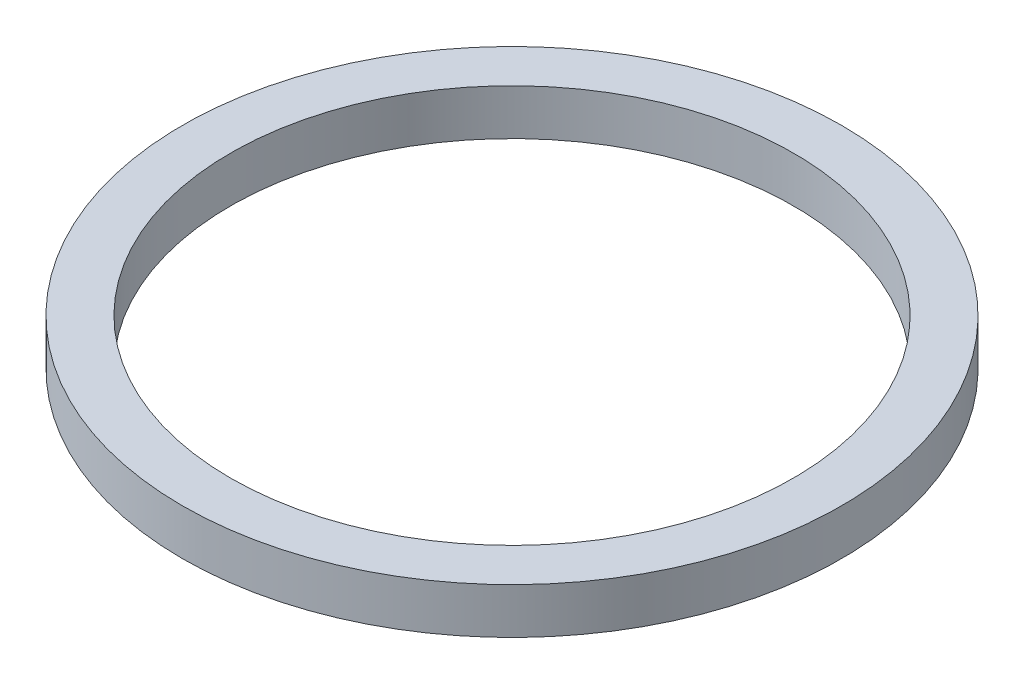
ISO-10303-21;
HEADER;
FILE_DESCRIPTION(('STEP AP214'),'2;1');
FILE_NAME('part.step','',(''),(''),'','','');
FILE_SCHEMA(('AUTOMOTIVE_DESIGN { 1 0 10303 214 1 1 1 1 }'));
ENDSEC;
DATA;
#1=APPLICATION_CONTEXT('core data for automotive mechanical design processes');
#2=APPLICATION_PROTOCOL_DEFINITION('international standard','automotive_design',2000,#1);
#3=PRODUCT_CONTEXT('',#1,'mechanical');
#4=PRODUCT('Part','Part','',(#3));
#5=PRODUCT_RELATED_PRODUCT_CATEGORY('part','',(#4));
#6=PRODUCT_DEFINITION_FORMATION('','',#4);
#7=PRODUCT_DEFINITION_CONTEXT('part definition',#1,'design');
#8=PRODUCT_DEFINITION('design','',#6,#7);
#9=PRODUCT_DEFINITION_SHAPE('','',#8);
#10=(LENGTH_UNIT() NAMED_UNIT(*) SI_UNIT(.MILLI.,.METRE.));
#11=(NAMED_UNIT(*) PLANE_ANGLE_UNIT() SI_UNIT($,.RADIAN.));
#12=(NAMED_UNIT(*) SI_UNIT($,.STERADIAN.) SOLID_ANGLE_UNIT());
#13=UNCERTAINTY_MEASURE_WITH_UNIT(LENGTH_MEASURE(1.E-05),#10,'distance_accuracy_value','');
#14=(GEOMETRIC_REPRESENTATION_CONTEXT(3) GLOBAL_UNCERTAINTY_ASSIGNED_CONTEXT((#13)) GLOBAL_UNIT_ASSIGNED_CONTEXT((#10,
#11,#12)) REPRESENTATION_CONTEXT('',''));
#15=CARTESIAN_POINT('',(0.,0.,0.));
#16=DIRECTION('',(0.,0.,1.));
#17=DIRECTION('',(1.,0.,0.));
#18=AXIS2_PLACEMENT_3D('',#15,#16,#17);
#19=CARTESIAN_POINT('',(0.,0.5,0.));
#20=DIRECTION('',(0.,1.,0.));
#21=DIRECTION('',(0.,0.,1.));
#22=AXIS2_PLACEMENT_3D('',#19,#20,#21);
#23=PLANE('',#22);
#24=CARTESIAN_POINT('',(0.,0.5,0.));
#25=DIRECTION('',(0.,1.,0.));
#26=DIRECTION('',(0.,0.,1.));
#27=AXIS2_PLACEMENT_3D('',#24,#25,#26);
#28=CIRCLE('',#27,3.6);
#29=CARTESIAN_POINT('',(0.,0.5,3.6));
#30=VERTEX_POINT('',#29);
#31=EDGE_CURVE('E10',#30,#30,#28,.T.);
#32=ORIENTED_EDGE('',*,*,#31,.T.);
#33=EDGE_LOOP('',(#32));
#34=FACE_BOUND('',#33,.T.);
#35=CARTESIAN_POINT('',(0.,0.5,0.));
#36=DIRECTION('',(0.,1.,0.));
#37=DIRECTION('',(0.,0.,1.));
#38=AXIS2_PLACEMENT_3D('',#35,#36,#37);
#39=CIRCLE('',#38,3.075);
#40=CARTESIAN_POINT('',(0.,0.5,3.075));
#41=VERTEX_POINT('',#40);
#42=EDGE_CURVE('E48',#41,#41,#39,.T.);
#43=ORIENTED_EDGE('',*,*,#42,.F.);
#44=EDGE_LOOP('',(#43));
#45=FACE_BOUND('',#44,.T.);
#46=ADVANCED_FACE('F37',(#34,#45),#23,.T.);
#47=CARTESIAN_POINT('',(0.,0.,0.));
#48=DIRECTION('',(0.,1.,0.));
#49=DIRECTION('',(0.,0.,1.));
#50=AXIS2_PLACEMENT_3D('',#47,#48,#49);
#51=PLANE('',#50);
#52=CARTESIAN_POINT('',(0.,0.,0.));
#53=DIRECTION('',(0.,1.,0.));
#54=DIRECTION('',(0.,0.,1.));
#55=AXIS2_PLACEMENT_3D('',#52,#53,#54);
#56=CIRCLE('',#55,3.6);
#57=CARTESIAN_POINT('',(0.,0.,3.6));
#58=VERTEX_POINT('',#57);
#59=EDGE_CURVE('E41',#58,#58,#56,.T.);
#60=ORIENTED_EDGE('',*,*,#59,.F.);
#61=EDGE_LOOP('',(#60));
#62=FACE_BOUND('',#61,.T.);
#63=CARTESIAN_POINT('',(0.,0.,0.));
#64=DIRECTION('',(0.,1.,0.));
#65=DIRECTION('',(0.,0.,1.));
#66=AXIS2_PLACEMENT_3D('',#63,#64,#65);
#67=CIRCLE('',#66,3.075);
#68=CARTESIAN_POINT('',(0.,0.,3.075));
#69=VERTEX_POINT('',#68);
#70=EDGE_CURVE('E50',#69,#69,#67,.T.);
#71=ORIENTED_EDGE('',*,*,#70,.T.);
#72=EDGE_LOOP('',(#71));
#73=FACE_BOUND('',#72,.T.);
#74=ADVANCED_FACE('F60',(#62,#73),#51,.F.);
#75=CARTESIAN_POINT('',(0.,0.5,0.));
#76=DIRECTION('',(0.,-1.,0.));
#77=DIRECTION('',(0.,0.,-1.));
#78=AXIS2_PLACEMENT_3D('',#75,#76,#77);
#79=CYLINDRICAL_SURFACE('',#78,3.6);
#80=ORIENTED_EDGE('',*,*,#31,.F.);
#81=EDGE_LOOP('',(#80));
#82=FACE_BOUND('',#81,.T.);
#83=ORIENTED_EDGE('',*,*,#59,.T.);
#84=EDGE_LOOP('',(#83));
#85=FACE_BOUND('',#84,.T.);
#86=ADVANCED_FACE('F39',(#82,#85),#79,.T.);
#87=CARTESIAN_POINT('',(0.,0.5,0.));
#88=DIRECTION('',(0.,-1.,0.));
#89=DIRECTION('',(0.,0.,-1.));
#90=AXIS2_PLACEMENT_3D('',#87,#88,#89);
#91=CYLINDRICAL_SURFACE('',#90,3.075);
#92=ORIENTED_EDGE('',*,*,#42,.T.);
#93=EDGE_LOOP('',(#92));
#94=FACE_BOUND('',#93,.T.);
#95=ORIENTED_EDGE('',*,*,#70,.F.);
#96=EDGE_LOOP('',(#95));
#97=FACE_BOUND('',#96,.T.);
#98=ADVANCED_FACE('F56',(#94,#97),#91,.F.);
#99=CLOSED_SHELL('',(#46,#74,#86,#98));
#100=MANIFOLD_SOLID_BREP('B2',#99);
#101=ADVANCED_BREP_SHAPE_REPRESENTATION('',(#18,#100),#14);
#102=SHAPE_DEFINITION_REPRESENTATION(#9,#101);
ENDSEC;
END-ISO-10303-21;
